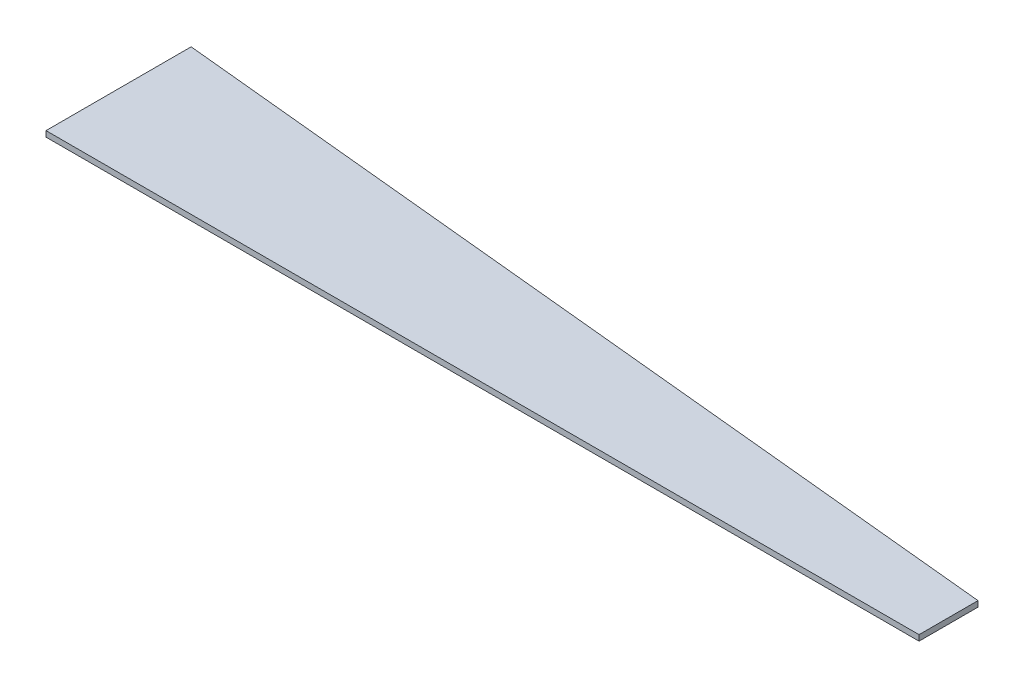
ISO-10303-21;
HEADER;
FILE_DESCRIPTION(('STEP AP214'),'2;1');
FILE_NAME('part.step','',(''),(''),'','','');
FILE_SCHEMA(('AUTOMOTIVE_DESIGN { 1 0 10303 214 1 1 1 1 }'));
ENDSEC;
DATA;
#1=APPLICATION_CONTEXT('core data for automotive mechanical design processes');
#2=APPLICATION_PROTOCOL_DEFINITION('international standard','automotive_design',2000,#1);
#3=PRODUCT_CONTEXT('',#1,'mechanical');
#4=PRODUCT('Part','Part','',(#3));
#5=PRODUCT_RELATED_PRODUCT_CATEGORY('part','',(#4));
#6=PRODUCT_DEFINITION_FORMATION('','',#4);
#7=PRODUCT_DEFINITION_CONTEXT('part definition',#1,'design');
#8=PRODUCT_DEFINITION('design','',#6,#7);
#9=PRODUCT_DEFINITION_SHAPE('','',#8);
#10=(LENGTH_UNIT() NAMED_UNIT(*) SI_UNIT(.MILLI.,.METRE.));
#11=(NAMED_UNIT(*) PLANE_ANGLE_UNIT() SI_UNIT($,.RADIAN.));
#12=(NAMED_UNIT(*) SI_UNIT($,.STERADIAN.) SOLID_ANGLE_UNIT());
#13=UNCERTAINTY_MEASURE_WITH_UNIT(LENGTH_MEASURE(1.E-05),#10,'distance_accuracy_value','');
#14=(GEOMETRIC_REPRESENTATION_CONTEXT(3) GLOBAL_UNCERTAINTY_ASSIGNED_CONTEXT((#13)) GLOBAL_UNIT_ASSIGNED_CONTEXT((#10,
#11,#12)) REPRESENTATION_CONTEXT('',''));
#15=CARTESIAN_POINT('',(0.,0.,0.));
#16=DIRECTION('',(0.,0.,1.));
#17=DIRECTION('',(1.,0.,0.));
#18=AXIS2_PLACEMENT_3D('',#15,#16,#17);
#19=CARTESIAN_POINT('',(0.,3.175,0.));
#20=DIRECTION('',(1.,0.,0.));
#21=DIRECTION('',(0.,0.,-1.));
#22=AXIS2_PLACEMENT_3D('',#19,#20,#21);
#23=PLANE('',#22);
#24=DIRECTION('',(0.,0.,1.));
#25=VECTOR('',#24,1.);
#26=CARTESIAN_POINT('',(0.,0.,0.));
#27=LINE('',#26,#25);
#28=CARTESIAN_POINT('',(0.,0.,0.));
#29=VERTEX_POINT('',#28);
#30=CARTESIAN_POINT('',(0.,0.,81.28));
#31=VERTEX_POINT('',#30);
#32=EDGE_CURVE('E96',#29,#31,#27,.T.);
#33=ORIENTED_EDGE('',*,*,#32,.T.);
#34=DIRECTION('',(0.,-1.,0.));
#35=VECTOR('',#34,1.);
#36=CARTESIAN_POINT('',(0.,3.175,81.28));
#37=LINE('',#36,#35);
#38=CARTESIAN_POINT('',(0.,3.175,81.28));
#39=VERTEX_POINT('',#38);
#40=EDGE_CURVE('E11',#39,#31,#37,.T.);
#41=ORIENTED_EDGE('',*,*,#40,.F.);
#42=DIRECTION('',(0.,0.,1.));
#43=VECTOR('',#42,1.);
#44=CARTESIAN_POINT('',(0.,3.175,0.));
#45=LINE('',#44,#43);
#46=CARTESIAN_POINT('',(0.,3.175,0.));
#47=VERTEX_POINT('',#46);
#48=EDGE_CURVE('E84',#47,#39,#45,.T.);
#49=ORIENTED_EDGE('',*,*,#48,.F.);
#50=DIRECTION('',(0.,-1.,0.));
#51=VECTOR('',#50,1.);
#52=CARTESIAN_POINT('',(0.,3.175,0.));
#53=LINE('',#52,#51);
#54=EDGE_CURVE('E92',#47,#29,#53,.T.);
#55=ORIENTED_EDGE('',*,*,#54,.T.);
#56=EDGE_LOOP('',(#33,#41,#49,#55));
#57=FACE_BOUND('',#56,.T.);
#58=ADVANCED_FACE('F33',(#57),#23,.F.);
#59=CARTESIAN_POINT('',(0.,3.175,81.28));
#60=DIRECTION('',(0.,0.,-1.));
#61=DIRECTION('',(-1.,0.,0.));
#62=AXIS2_PLACEMENT_3D('',#59,#60,#61);
#63=PLANE('',#62);
#64=DIRECTION('',(1.,0.,0.));
#65=VECTOR('',#64,1.);
#66=CARTESIAN_POINT('',(0.,0.,81.28));
#67=LINE('',#66,#65);
#68=CARTESIAN_POINT('',(488.95,0.,81.28));
#69=VERTEX_POINT('',#68);
#70=EDGE_CURVE('E88',#31,#69,#67,.T.);
#71=ORIENTED_EDGE('',*,*,#70,.T.);
#72=DIRECTION('',(0.,-1.,0.));
#73=VECTOR('',#72,1.);
#74=CARTESIAN_POINT('',(488.95,3.175,81.28));
#75=LINE('',#74,#73);
#76=CARTESIAN_POINT('',(488.95,3.175,81.28));
#77=VERTEX_POINT('',#76);
#78=EDGE_CURVE('E41',#77,#69,#75,.T.);
#79=ORIENTED_EDGE('',*,*,#78,.F.);
#80=DIRECTION('',(1.,0.,0.));
#81=VECTOR('',#80,1.);
#82=CARTESIAN_POINT('',(0.,3.175,81.28));
#83=LINE('',#82,#81);
#84=EDGE_CURVE('E79',#39,#77,#83,.T.);
#85=ORIENTED_EDGE('',*,*,#84,.F.);
#86=ORIENTED_EDGE('',*,*,#40,.T.);
#87=EDGE_LOOP('',(#71,#79,#85,#86));
#88=FACE_BOUND('',#87,.T.);
#89=ADVANCED_FACE('F87',(#88),#63,.F.);
#90=CARTESIAN_POINT('',(488.95,3.175,48.26));
#91=DIRECTION('',(-1.,0.,0.));
#92=DIRECTION('',(0.,0.,1.));
#93=AXIS2_PLACEMENT_3D('',#90,#91,#92);
#94=PLANE('',#93);
#95=DIRECTION('',(0.,0.,-1.));
#96=VECTOR('',#95,1.);
#97=CARTESIAN_POINT('',(488.95,0.,48.26));
#98=LINE('',#97,#96);
#99=CARTESIAN_POINT('',(488.95,0.,48.26));
#100=VERTEX_POINT('',#99);
#101=EDGE_CURVE('E66',#69,#100,#98,.T.);
#102=ORIENTED_EDGE('',*,*,#101,.T.);
#103=DIRECTION('',(0.,-1.,0.));
#104=VECTOR('',#103,1.);
#105=CARTESIAN_POINT('',(488.95,3.175,48.26));
#106=LINE('',#105,#104);
#107=CARTESIAN_POINT('',(488.95,3.175,48.26));
#108=VERTEX_POINT('',#107);
#109=EDGE_CURVE('E89',#108,#100,#106,.T.);
#110=ORIENTED_EDGE('',*,*,#109,.F.);
#111=DIRECTION('',(0.,0.,-1.));
#112=VECTOR('',#111,1.);
#113=CARTESIAN_POINT('',(488.95,3.175,48.26));
#114=LINE('',#113,#112);
#115=EDGE_CURVE('E82',#77,#108,#114,.T.);
#116=ORIENTED_EDGE('',*,*,#115,.F.);
#117=ORIENTED_EDGE('',*,*,#78,.T.);
#118=EDGE_LOOP('',(#102,#110,#116,#117));
#119=FACE_BOUND('',#118,.T.);
#120=ADVANCED_FACE('F90',(#119),#94,.F.);
#121=CARTESIAN_POINT('',(0.,3.175,0.));
#122=DIRECTION('',(-0.0982240117825374,0.,0.995164329902024));
#123=DIRECTION('',(0.995164329902024,0.,0.0982240117825374));
#124=AXIS2_PLACEMENT_3D('',#121,#122,#123);
#125=PLANE('',#124);
#126=DIRECTION('',(-0.995164329902024,0.,-0.0982240117825374));
#127=VECTOR('',#126,1.);
#128=CARTESIAN_POINT('',(0.,0.,0.));
#129=LINE('',#128,#127);
#130=EDGE_CURVE('E72',#100,#29,#129,.T.);
#131=ORIENTED_EDGE('',*,*,#130,.T.);
#132=ORIENTED_EDGE('',*,*,#54,.F.);
#133=DIRECTION('',(-0.995164329902024,0.,-0.0982240117825374));
#134=VECTOR('',#133,1.);
#135=CARTESIAN_POINT('',(0.,3.175,0.));
#136=LINE('',#135,#134);
#137=EDGE_CURVE('E49',#108,#47,#136,.T.);
#138=ORIENTED_EDGE('',*,*,#137,.F.);
#139=ORIENTED_EDGE('',*,*,#109,.T.);
#140=EDGE_LOOP('',(#131,#132,#138,#139));
#141=FACE_BOUND('',#140,.T.);
#142=ADVANCED_FACE('F103',(#141),#125,.F.);
#143=CARTESIAN_POINT('',(0.,3.175,0.));
#144=DIRECTION('',(0.,1.,0.));
#145=DIRECTION('',(0.,0.,1.));
#146=AXIS2_PLACEMENT_3D('',#143,#144,#145);
#147=PLANE('',#146);
#148=ORIENTED_EDGE('',*,*,#48,.T.);
#149=ORIENTED_EDGE('',*,*,#84,.T.);
#150=ORIENTED_EDGE('',*,*,#115,.T.);
#151=ORIENTED_EDGE('',*,*,#137,.T.);
#152=EDGE_LOOP('',(#148,#149,#150,#151));
#153=FACE_BOUND('',#152,.T.);
#154=ADVANCED_FACE('F80',(#153),#147,.T.);
#155=CARTESIAN_POINT('',(0.,0.,0.));
#156=DIRECTION('',(0.,1.,0.));
#157=DIRECTION('',(0.,0.,1.));
#158=AXIS2_PLACEMENT_3D('',#155,#156,#157);
#159=PLANE('',#158);
#160=ORIENTED_EDGE('',*,*,#32,.F.);
#161=ORIENTED_EDGE('',*,*,#130,.F.);
#162=ORIENTED_EDGE('',*,*,#101,.F.);
#163=ORIENTED_EDGE('',*,*,#70,.F.);
#164=EDGE_LOOP('',(#160,#161,#162,#163));
#165=FACE_BOUND('',#164,.T.);
#166=ADVANCED_FACE('F106',(#165),#159,.F.);
#167=CLOSED_SHELL('',(#58,#89,#120,#142,#154,#166));
#168=MANIFOLD_SOLID_BREP('B2',#167);
#169=ADVANCED_BREP_SHAPE_REPRESENTATION('',(#18,#168),#14);
#170=SHAPE_DEFINITION_REPRESENTATION(#9,#169);
ENDSEC;
END-ISO-10303-21;
